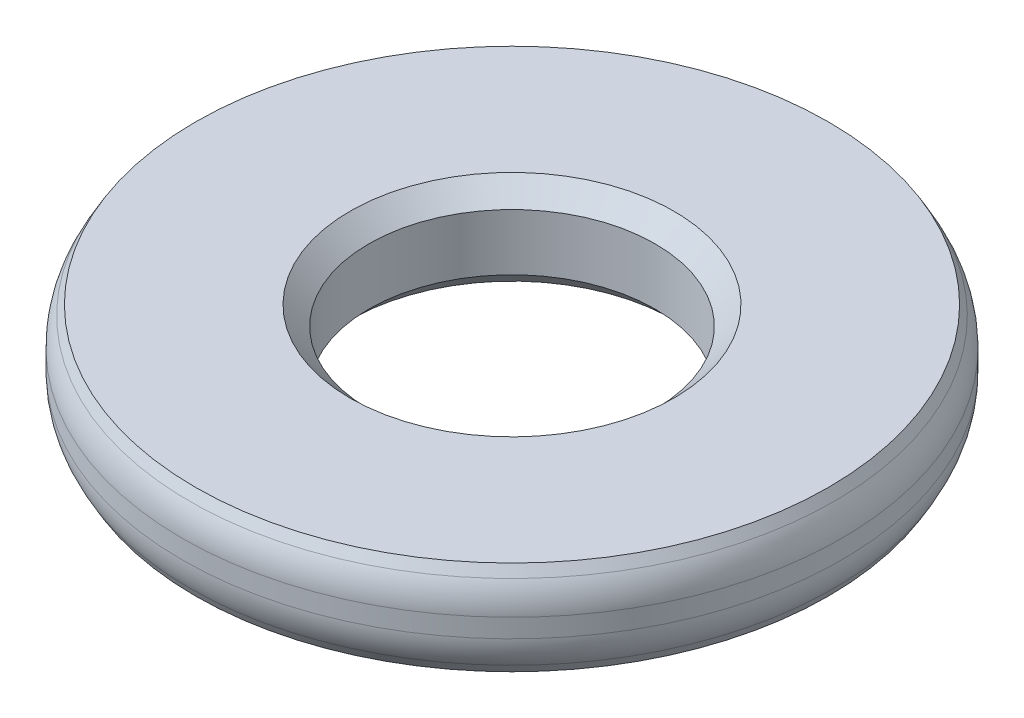
ISO-10303-21;
HEADER;
FILE_DESCRIPTION(('STEP AP214'),'2;1');
FILE_NAME('part.step','',(''),(''),'','','');
FILE_SCHEMA(('AUTOMOTIVE_DESIGN { 1 0 10303 214 1 1 1 1 }'));
ENDSEC;
DATA;
#1=APPLICATION_CONTEXT('core data for automotive mechanical design processes');
#2=APPLICATION_PROTOCOL_DEFINITION('international standard','automotive_design',2000,#1);
#3=PRODUCT_CONTEXT('',#1,'mechanical');
#4=PRODUCT('Part','Part','',(#3));
#5=PRODUCT_RELATED_PRODUCT_CATEGORY('part','',(#4));
#6=PRODUCT_DEFINITION_FORMATION('','',#4);
#7=PRODUCT_DEFINITION_CONTEXT('part definition',#1,'design');
#8=PRODUCT_DEFINITION('design','',#6,#7);
#9=PRODUCT_DEFINITION_SHAPE('','',#8);
#10=(LENGTH_UNIT() NAMED_UNIT(*) SI_UNIT(.MILLI.,.METRE.));
#11=(NAMED_UNIT(*) PLANE_ANGLE_UNIT() SI_UNIT($,.RADIAN.));
#12=(NAMED_UNIT(*) SI_UNIT($,.STERADIAN.) SOLID_ANGLE_UNIT());
#13=UNCERTAINTY_MEASURE_WITH_UNIT(LENGTH_MEASURE(1.E-05),#10,'distance_accuracy_value','');
#14=(GEOMETRIC_REPRESENTATION_CONTEXT(3) GLOBAL_UNCERTAINTY_ASSIGNED_CONTEXT((#13)) GLOBAL_UNIT_ASSIGNED_CONTEXT((#10,
#11,#12)) REPRESENTATION_CONTEXT('',''));
#15=CARTESIAN_POINT('',(0.,0.,0.));
#16=DIRECTION('',(0.,0.,1.));
#17=DIRECTION('',(1.,0.,0.));
#18=AXIS2_PLACEMENT_3D('',#15,#16,#17);
#19=CARTESIAN_POINT('',(0.,5.,0.));
#20=DIRECTION('',(0.,-1.,0.));
#21=DIRECTION('',(0.,0.,-1.));
#22=AXIS2_PLACEMENT_3D('',#19,#20,#21);
#23=CYLINDRICAL_SURFACE('',#22,17.5);
#24=CARTESIAN_POINT('',(0.,2.00384757729336,0.));
#25=DIRECTION('',(0.,-1.,0.));
#26=DIRECTION('',(0.,0.,-1.));
#27=AXIS2_PLACEMENT_3D('',#24,#25,#26);
#28=CIRCLE('',#27,17.5);
#29=CARTESIAN_POINT('',(0.,2.00384757729336,-17.5));
#30=VERTEX_POINT('',#29);
#31=EDGE_CURVE('E61',#30,#30,#28,.F.);
#32=ORIENTED_EDGE('',*,*,#31,.T.);
#33=EDGE_LOOP('',(#32));
#34=FACE_BOUND('',#33,.T.);
#35=CARTESIAN_POINT('',(0.,2.99615242270664,0.));
#36=DIRECTION('',(0.,1.,0.));
#37=DIRECTION('',(0.,0.,1.));
#38=AXIS2_PLACEMENT_3D('',#35,#36,#37);
#39=CIRCLE('',#38,17.5);
#40=CARTESIAN_POINT('',(0.,2.99615242270664,17.5));
#41=VERTEX_POINT('',#40);
#42=EDGE_CURVE('E64',#41,#41,#39,.F.);
#43=ORIENTED_EDGE('',*,*,#42,.T.);
#44=EDGE_LOOP('',(#43));
#45=FACE_BOUND('',#44,.T.);
#46=ADVANCED_FACE('F34',(#34,#45),#23,.T.);
#47=CARTESIAN_POINT('',(0.,5.,0.));
#48=DIRECTION('',(0.,1.,0.));
#49=DIRECTION('',(0.,0.,1.));
#50=AXIS2_PLACEMENT_3D('',#47,#48,#49);
#51=PLANE('',#50);
#52=CARTESIAN_POINT('',(0.,5.,0.));
#53=DIRECTION('',(0.,1.,0.));
#54=DIRECTION('',(0.,0.,1.));
#55=AXIS2_PLACEMENT_3D('',#52,#53,#54);
#56=CIRCLE('',#55,8.6);
#57=CARTESIAN_POINT('',(0.,5.,8.6));
#58=VERTEX_POINT('',#57);
#59=EDGE_CURVE('E10',#58,#58,#56,.F.);
#60=ORIENTED_EDGE('',*,*,#59,.T.);
#61=EDGE_LOOP('',(#60));
#62=FACE_BOUND('',#61,.T.);
#63=CARTESIAN_POINT('',(0.,5.,0.));
#64=DIRECTION('',(0.,1.,0.));
#65=DIRECTION('',(0.,0.,1.));
#66=AXIS2_PLACEMENT_3D('',#63,#64,#65);
#67=CIRCLE('',#66,16.8071796769725);
#68=CARTESIAN_POINT('',(0.,5.,16.8071796769725));
#69=VERTEX_POINT('',#68);
#70=EDGE_CURVE('E70',#69,#69,#67,.T.);
#71=ORIENTED_EDGE('',*,*,#70,.T.);
#72=EDGE_LOOP('',(#71));
#73=FACE_BOUND('',#72,.T.);
#74=ADVANCED_FACE('F74',(#62,#73),#51,.T.);
#75=CARTESIAN_POINT('',(0.,0.,0.));
#76=DIRECTION('',(0.,1.,0.));
#77=DIRECTION('',(0.,0.,1.));
#78=AXIS2_PLACEMENT_3D('',#75,#76,#77);
#79=PLANE('',#78);
#80=CARTESIAN_POINT('',(0.,0.,0.));
#81=DIRECTION('',(0.,1.,0.));
#82=DIRECTION('',(0.,0.,1.));
#83=AXIS2_PLACEMENT_3D('',#80,#81,#82);
#84=CIRCLE('',#83,8.59999999999999);
#85=CARTESIAN_POINT('',(0.,0.,8.59999999999999));
#86=VERTEX_POINT('',#85);
#87=EDGE_CURVE('E50',#86,#86,#84,.T.);
#88=ORIENTED_EDGE('',*,*,#87,.T.);
#89=EDGE_LOOP('',(#88));
#90=FACE_BOUND('',#89,.T.);
#91=CARTESIAN_POINT('',(0.,0.,0.));
#92=DIRECTION('',(0.,1.,0.));
#93=DIRECTION('',(0.,0.,1.));
#94=AXIS2_PLACEMENT_3D('',#91,#92,#93);
#95=CIRCLE('',#94,16.8071796769725);
#96=CARTESIAN_POINT('',(0.,0.,16.8071796769725));
#97=VERTEX_POINT('',#96);
#98=EDGE_CURVE('E67',#97,#97,#95,.F.);
#99=ORIENTED_EDGE('',*,*,#98,.T.);
#100=EDGE_LOOP('',(#99));
#101=FACE_BOUND('',#100,.T.);
#102=ADVANCED_FACE('F89',(#90,#101),#79,.F.);
#103=CARTESIAN_POINT('',(0.,0.,0.));
#104=DIRECTION('',(0.,1.,0.));
#105=DIRECTION('',(0.,0.,1.));
#106=AXIS2_PLACEMENT_3D('',#103,#104,#105);
#107=CYLINDRICAL_SURFACE('',#106,7.6);
#108=CARTESIAN_POINT('',(0.,0.999999999999997,0.));
#109=DIRECTION('',(0.,1.,0.));
#110=DIRECTION('',(0.,0.,1.));
#111=AXIS2_PLACEMENT_3D('',#108,#109,#110);
#112=CIRCLE('',#111,7.6);
#113=CARTESIAN_POINT('',(0.,0.999999999999997,7.6));
#114=VERTEX_POINT('',#113);
#115=EDGE_CURVE('E42',#114,#114,#112,.F.);
#116=ORIENTED_EDGE('',*,*,#115,.T.);
#117=EDGE_LOOP('',(#116));
#118=FACE_BOUND('',#117,.T.);
#119=CARTESIAN_POINT('',(0.,4.,0.));
#120=DIRECTION('',(0.,1.,0.));
#121=DIRECTION('',(0.,0.,1.));
#122=AXIS2_PLACEMENT_3D('',#119,#120,#121);
#123=CIRCLE('',#122,7.6);
#124=CARTESIAN_POINT('',(0.,4.,7.6));
#125=VERTEX_POINT('',#124);
#126=EDGE_CURVE('E46',#125,#125,#123,.T.);
#127=ORIENTED_EDGE('',*,*,#126,.T.);
#128=EDGE_LOOP('',(#127));
#129=FACE_BOUND('',#128,.T.);
#130=ADVANCED_FACE('F79',(#118,#129),#107,.F.);
#131=CARTESIAN_POINT('',(0.,5.,0.));
#132=DIRECTION('',(0.,-1.,0.));
#133=DIRECTION('',(0.,0.,-1.));
#134=AXIS2_PLACEMENT_3D('',#131,#132,#133);
#135=CONICAL_SURFACE('',#134,16.8071796769725,0.523598775598295);
#136=CARTESIAN_POINT('',(0.,4.49615242270663,0.));
#137=DIRECTION('',(0.,-1.,0.));
#138=DIRECTION('',(0.,0.,-1.));
#139=AXIS2_PLACEMENT_3D('',#136,#137,#138);
#140=CIRCLE('',#139,17.0980762113533);
#141=CARTESIAN_POINT('',(0.,4.49615242270663,-17.0980762113533));
#142=VERTEX_POINT('',#141);
#143=EDGE_CURVE('E55',#142,#142,#140,.F.);
#144=ORIENTED_EDGE('',*,*,#143,.T.);
#145=EDGE_LOOP('',(#144));
#146=FACE_BOUND('',#145,.T.);
#147=ORIENTED_EDGE('',*,*,#70,.F.);
#148=EDGE_LOOP('',(#147));
#149=FACE_BOUND('',#148,.T.);
#150=ADVANCED_FACE('F76',(#146,#149),#135,.T.);
#151=CARTESIAN_POINT('',(0.,1.2,0.));
#152=DIRECTION('',(0.,1.,0.));
#153=DIRECTION('',(0.,0.,1.));
#154=AXIS2_PLACEMENT_3D('',#151,#152,#153);
#155=CONICAL_SURFACE('',#154,17.5,0.523598775598295);
#156=CARTESIAN_POINT('',(0.,0.503847577293371,0.));
#157=DIRECTION('',(0.,1.,0.));
#158=DIRECTION('',(0.,0.,1.));
#159=AXIS2_PLACEMENT_3D('',#156,#157,#158);
#160=CIRCLE('',#159,17.0980762113533);
#161=CARTESIAN_POINT('',(0.,0.503847577293371,17.0980762113533));
#162=VERTEX_POINT('',#161);
#163=EDGE_CURVE('E58',#162,#162,#160,.F.);
#164=ORIENTED_EDGE('',*,*,#163,.T.);
#165=EDGE_LOOP('',(#164));
#166=FACE_BOUND('',#165,.T.);
#167=ORIENTED_EDGE('',*,*,#98,.F.);
#168=EDGE_LOOP('',(#167));
#169=FACE_BOUND('',#168,.T.);
#170=ADVANCED_FACE('F78',(#166,#169),#155,.T.);
#171=CARTESIAN_POINT('',(0.,2.00384757729336,0.));
#172=DIRECTION('',(0.,-1.,0.));
#173=DIRECTION('',(0.,0.,-1.));
#174=AXIS2_PLACEMENT_3D('',#171,#172,#173);
#175=TOROIDAL_SURFACE('',#174,14.5,3.);
#176=ORIENTED_EDGE('',*,*,#163,.F.);
#177=EDGE_LOOP('',(#176));
#178=FACE_BOUND('',#177,.T.);
#179=ORIENTED_EDGE('',*,*,#31,.F.);
#180=EDGE_LOOP('',(#179));
#181=FACE_BOUND('',#180,.T.);
#182=ADVANCED_FACE('F86',(#178,#181),#175,.T.);
#183=CARTESIAN_POINT('',(0.,2.99615242270664,0.));
#184=DIRECTION('',(0.,1.,0.));
#185=DIRECTION('',(0.,0.,1.));
#186=AXIS2_PLACEMENT_3D('',#183,#184,#185);
#187=TOROIDAL_SURFACE('',#186,14.5,3.);
#188=ORIENTED_EDGE('',*,*,#143,.F.);
#189=EDGE_LOOP('',(#188));
#190=FACE_BOUND('',#189,.T.);
#191=ORIENTED_EDGE('',*,*,#42,.F.);
#192=EDGE_LOOP('',(#191));
#193=FACE_BOUND('',#192,.T.);
#194=ADVANCED_FACE('F112',(#190,#193),#187,.T.);
#195=CARTESIAN_POINT('',(0.,0.,0.));
#196=DIRECTION('',(0.,-1.,0.));
#197=DIRECTION('',(0.,0.,-1.));
#198=AXIS2_PLACEMENT_3D('',#195,#196,#197);
#199=CONICAL_SURFACE('',#198,8.59999999999999,0.785398163397445);
#200=ORIENTED_EDGE('',*,*,#115,.F.);
#201=EDGE_LOOP('',(#200));
#202=FACE_BOUND('',#201,.T.);
#203=ORIENTED_EDGE('',*,*,#87,.F.);
#204=EDGE_LOOP('',(#203));
#205=FACE_BOUND('',#204,.T.);
#206=ADVANCED_FACE('F110',(#202,#205),#199,.F.);
#207=CARTESIAN_POINT('',(0.,4.,0.));
#208=DIRECTION('',(0.,1.,0.));
#209=DIRECTION('',(0.,0.,1.));
#210=AXIS2_PLACEMENT_3D('',#207,#208,#209);
#211=CONICAL_SURFACE('',#210,7.6,0.785398163397448);
#212=ORIENTED_EDGE('',*,*,#59,.F.);
#213=EDGE_LOOP('',(#212));
#214=FACE_BOUND('',#213,.T.);
#215=ORIENTED_EDGE('',*,*,#126,.F.);
#216=EDGE_LOOP('',(#215));
#217=FACE_BOUND('',#216,.T.);
#218=ADVANCED_FACE('F37',(#214,#217),#211,.F.);
#219=CLOSED_SHELL('',(#46,#74,#102,#130,#150,#170,#182,#194,#206,#218));
#220=MANIFOLD_SOLID_BREP('B2',#219);
#221=ADVANCED_BREP_SHAPE_REPRESENTATION('',(#18,#220),#14);
#222=SHAPE_DEFINITION_REPRESENTATION(#9,#221);
ENDSEC;
END-ISO-10303-21;
